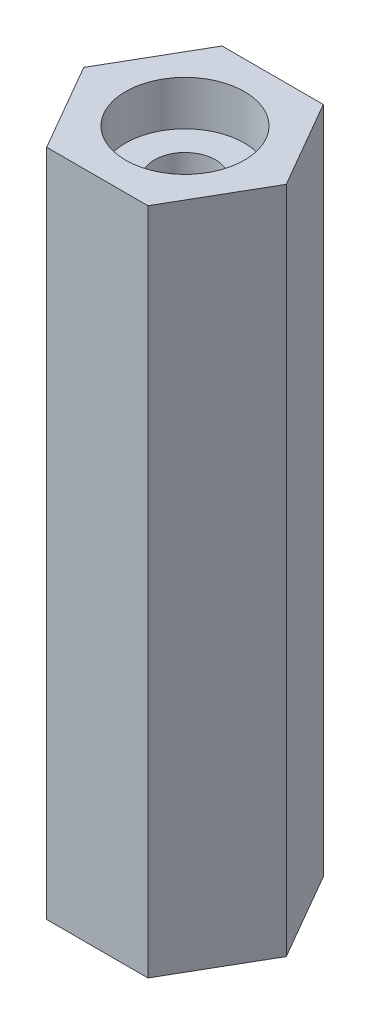
ISO-10303-21;
HEADER;
FILE_DESCRIPTION(('STEP AP214'),'2;1');
FILE_NAME('part.step','',(''),(''),'','','');
FILE_SCHEMA(('AUTOMOTIVE_DESIGN { 1 0 10303 214 1 1 1 1 }'));
ENDSEC;
DATA;
#1=APPLICATION_CONTEXT('core data for automotive mechanical design processes');
#2=APPLICATION_PROTOCOL_DEFINITION('international standard','automotive_design',2000,#1);
#3=PRODUCT_CONTEXT('',#1,'mechanical');
#4=PRODUCT('Part','Part','',(#3));
#5=PRODUCT_RELATED_PRODUCT_CATEGORY('part','',(#4));
#6=PRODUCT_DEFINITION_FORMATION('','',#4);
#7=PRODUCT_DEFINITION_CONTEXT('part definition',#1,'design');
#8=PRODUCT_DEFINITION('design','',#6,#7);
#9=PRODUCT_DEFINITION_SHAPE('','',#8);
#10=(LENGTH_UNIT() NAMED_UNIT(*) SI_UNIT(.MILLI.,.METRE.));
#11=(NAMED_UNIT(*) PLANE_ANGLE_UNIT() SI_UNIT($,.RADIAN.));
#12=(NAMED_UNIT(*) SI_UNIT($,.STERADIAN.) SOLID_ANGLE_UNIT());
#13=UNCERTAINTY_MEASURE_WITH_UNIT(LENGTH_MEASURE(1.E-05),#10,'distance_accuracy_value','');
#14=(GEOMETRIC_REPRESENTATION_CONTEXT(3) GLOBAL_UNCERTAINTY_ASSIGNED_CONTEXT((#13)) GLOBAL_UNIT_ASSIGNED_CONTEXT((#10,
#11,#12)) REPRESENTATION_CONTEXT('',''));
#15=CARTESIAN_POINT('',(0.,0.,0.));
#16=DIRECTION('',(0.,0.,1.));
#17=DIRECTION('',(1.,0.,0.));
#18=AXIS2_PLACEMENT_3D('',#15,#16,#17);
#19=CARTESIAN_POINT('',(3.4063665882188,45.,5.9));
#20=DIRECTION('',(-0.866025403784439,0.,-0.5));
#21=DIRECTION('',(-0.5,0.,0.866025403784439));
#22=AXIS2_PLACEMENT_3D('',#19,#20,#21);
#23=PLANE('',#22);
#24=DIRECTION('',(0.5,0.,-0.866025403784439));
#25=VECTOR('',#24,1.);
#26=CARTESIAN_POINT('',(3.4063665882188,0.,5.9));
#27=LINE('',#26,#25);
#28=CARTESIAN_POINT('',(3.4063665882188,0.,5.9));
#29=VERTEX_POINT('',#28);
#30=CARTESIAN_POINT('',(6.81273317643759,0.,0.));
#31=VERTEX_POINT('',#30);
#32=EDGE_CURVE('E117',#29,#31,#27,.T.);
#33=ORIENTED_EDGE('',*,*,#32,.T.);
#34=DIRECTION('',(0.,-1.,0.));
#35=VECTOR('',#34,1.);
#36=CARTESIAN_POINT('',(6.81273317643759,45.,0.));
#37=LINE('',#36,#35);
#38=CARTESIAN_POINT('',(6.81273317643759,45.,0.));
#39=VERTEX_POINT('',#38);
#40=EDGE_CURVE('E40',#39,#31,#37,.T.);
#41=ORIENTED_EDGE('',*,*,#40,.F.);
#42=DIRECTION('',(0.5,0.,-0.866025403784439));
#43=VECTOR('',#42,1.);
#44=CARTESIAN_POINT('',(3.4063665882188,45.,5.9));
#45=LINE('',#44,#43);
#46=CARTESIAN_POINT('',(3.4063665882188,45.,5.9));
#47=VERTEX_POINT('',#46);
#48=EDGE_CURVE('E120',#47,#39,#45,.T.);
#49=ORIENTED_EDGE('',*,*,#48,.F.);
#50=DIRECTION('',(0.,-1.,0.));
#51=VECTOR('',#50,1.);
#52=CARTESIAN_POINT('',(3.4063665882188,45.,5.9));
#53=LINE('',#52,#51);
#54=EDGE_CURVE('E134',#47,#29,#53,.T.);
#55=ORIENTED_EDGE('',*,*,#54,.T.);
#56=EDGE_LOOP('',(#33,#41,#49,#55));
#57=FACE_BOUND('',#56,.T.);
#58=ADVANCED_FACE('F33',(#57),#23,.F.);
#59=CARTESIAN_POINT('',(6.81273317643759,45.,0.));
#60=DIRECTION('',(-0.866025403784438,0.,0.5));
#61=DIRECTION('',(0.5,0.,0.866025403784439));
#62=AXIS2_PLACEMENT_3D('',#59,#60,#61);
#63=PLANE('',#62);
#64=DIRECTION('',(-0.5,0.,-0.866025403784439));
#65=VECTOR('',#64,1.);
#66=CARTESIAN_POINT('',(6.81273317643759,0.,0.));
#67=LINE('',#66,#65);
#68=CARTESIAN_POINT('',(3.40636658821879,0.,-5.9));
#69=VERTEX_POINT('',#68);
#70=EDGE_CURVE('E137',#31,#69,#67,.T.);
#71=ORIENTED_EDGE('',*,*,#70,.T.);
#72=DIRECTION('',(0.,-1.,0.));
#73=VECTOR('',#72,1.);
#74=CARTESIAN_POINT('',(3.40636658821879,45.,-5.9));
#75=LINE('',#74,#73);
#76=CARTESIAN_POINT('',(3.40636658821879,45.,-5.9));
#77=VERTEX_POINT('',#76);
#78=EDGE_CURVE('E157',#77,#69,#75,.T.);
#79=ORIENTED_EDGE('',*,*,#78,.F.);
#80=DIRECTION('',(-0.5,0.,-0.866025403784439));
#81=VECTOR('',#80,1.);
#82=CARTESIAN_POINT('',(6.81273317643759,45.,0.));
#83=LINE('',#82,#81);
#84=EDGE_CURVE('E123',#39,#77,#83,.T.);
#85=ORIENTED_EDGE('',*,*,#84,.F.);
#86=ORIENTED_EDGE('',*,*,#40,.T.);
#87=EDGE_LOOP('',(#71,#79,#85,#86));
#88=FACE_BOUND('',#87,.T.);
#89=ADVANCED_FACE('F162',(#88),#63,.F.);
#90=CARTESIAN_POINT('',(3.40636658821879,45.,-5.9));
#91=DIRECTION('',(0.,0.,1.));
#92=DIRECTION('',(1.,0.,0.));
#93=AXIS2_PLACEMENT_3D('',#90,#91,#92);
#94=PLANE('',#93);
#95=DIRECTION('',(-1.,0.,0.));
#96=VECTOR('',#95,1.);
#97=CARTESIAN_POINT('',(3.40636658821879,0.,-5.9));
#98=LINE('',#97,#96);
#99=CARTESIAN_POINT('',(-3.40636658821879,0.,-5.9));
#100=VERTEX_POINT('',#99);
#101=EDGE_CURVE('E139',#69,#100,#98,.T.);
#102=ORIENTED_EDGE('',*,*,#101,.T.);
#103=DIRECTION('',(0.,-1.,0.));
#104=VECTOR('',#103,1.);
#105=CARTESIAN_POINT('',(-3.40636658821879,45.,-5.9));
#106=LINE('',#105,#104);
#107=CARTESIAN_POINT('',(-3.40636658821879,45.,-5.9));
#108=VERTEX_POINT('',#107);
#109=EDGE_CURVE('E154',#108,#100,#106,.T.);
#110=ORIENTED_EDGE('',*,*,#109,.F.);
#111=DIRECTION('',(-1.,0.,0.));
#112=VECTOR('',#111,1.);
#113=CARTESIAN_POINT('',(3.40636658821879,45.,-5.9));
#114=LINE('',#113,#112);
#115=EDGE_CURVE('E126',#77,#108,#114,.T.);
#116=ORIENTED_EDGE('',*,*,#115,.F.);
#117=ORIENTED_EDGE('',*,*,#78,.T.);
#118=EDGE_LOOP('',(#102,#110,#116,#117));
#119=FACE_BOUND('',#118,.T.);
#120=ADVANCED_FACE('F176',(#119),#94,.F.);
#121=CARTESIAN_POINT('',(-3.40636658821879,45.,-5.9));
#122=DIRECTION('',(0.866025403784439,0.,0.5));
#123=DIRECTION('',(0.5,0.,-0.866025403784439));
#124=AXIS2_PLACEMENT_3D('',#121,#122,#123);
#125=PLANE('',#124);
#126=DIRECTION('',(-0.5,0.,0.866025403784439));
#127=VECTOR('',#126,1.);
#128=CARTESIAN_POINT('',(-3.40636658821879,0.,-5.9));
#129=LINE('',#128,#127);
#130=CARTESIAN_POINT('',(-6.81273317643758,0.,0.));
#131=VERTEX_POINT('',#130);
#132=EDGE_CURVE('E141',#100,#131,#129,.T.);
#133=ORIENTED_EDGE('',*,*,#132,.T.);
#134=DIRECTION('',(0.,-1.,0.));
#135=VECTOR('',#134,1.);
#136=CARTESIAN_POINT('',(-6.81273317643758,45.,0.));
#137=LINE('',#136,#135);
#138=CARTESIAN_POINT('',(-6.81273317643758,45.,0.));
#139=VERTEX_POINT('',#138);
#140=EDGE_CURVE('E151',#139,#131,#137,.T.);
#141=ORIENTED_EDGE('',*,*,#140,.F.);
#142=DIRECTION('',(-0.5,0.,0.866025403784439));
#143=VECTOR('',#142,1.);
#144=CARTESIAN_POINT('',(-3.40636658821879,45.,-5.9));
#145=LINE('',#144,#143);
#146=EDGE_CURVE('E128',#108,#139,#145,.T.);
#147=ORIENTED_EDGE('',*,*,#146,.F.);
#148=ORIENTED_EDGE('',*,*,#109,.T.);
#149=EDGE_LOOP('',(#133,#141,#147,#148));
#150=FACE_BOUND('',#149,.T.);
#151=ADVANCED_FACE('F180',(#150),#125,.F.);
#152=CARTESIAN_POINT('',(-6.81273317643758,45.,0.));
#153=DIRECTION('',(0.866025403784439,0.,-0.5));
#154=DIRECTION('',(-0.5,0.,-0.866025403784439));
#155=AXIS2_PLACEMENT_3D('',#152,#153,#154);
#156=PLANE('',#155);
#157=DIRECTION('',(0.5,0.,0.866025403784439));
#158=VECTOR('',#157,1.);
#159=CARTESIAN_POINT('',(-6.81273317643758,0.,0.));
#160=LINE('',#159,#158);
#161=CARTESIAN_POINT('',(-3.40636658821879,0.,5.9));
#162=VERTEX_POINT('',#161);
#163=EDGE_CURVE('E143',#131,#162,#160,.T.);
#164=ORIENTED_EDGE('',*,*,#163,.T.);
#165=DIRECTION('',(0.,-1.,0.));
#166=VECTOR('',#165,1.);
#167=CARTESIAN_POINT('',(-3.40636658821879,45.,5.9));
#168=LINE('',#167,#166);
#169=CARTESIAN_POINT('',(-3.40636658821879,45.,5.9));
#170=VERTEX_POINT('',#169);
#171=EDGE_CURVE('E148',#170,#162,#168,.T.);
#172=ORIENTED_EDGE('',*,*,#171,.F.);
#173=DIRECTION('',(0.5,0.,0.866025403784439));
#174=VECTOR('',#173,1.);
#175=CARTESIAN_POINT('',(-6.81273317643758,45.,0.));
#176=LINE('',#175,#174);
#177=EDGE_CURVE('E130',#139,#170,#176,.T.);
#178=ORIENTED_EDGE('',*,*,#177,.F.);
#179=ORIENTED_EDGE('',*,*,#140,.T.);
#180=EDGE_LOOP('',(#164,#172,#178,#179));
#181=FACE_BOUND('',#180,.T.);
#182=ADVANCED_FACE('F190',(#181),#156,.F.);
#183=CARTESIAN_POINT('',(-3.40636658821879,45.,5.9));
#184=DIRECTION('',(0.,0.,-1.));
#185=DIRECTION('',(-1.,0.,0.));
#186=AXIS2_PLACEMENT_3D('',#183,#184,#185);
#187=PLANE('',#186);
#188=DIRECTION('',(1.,0.,0.));
#189=VECTOR('',#188,1.);
#190=CARTESIAN_POINT('',(-3.40636658821879,0.,5.9));
#191=LINE('',#190,#189);
#192=EDGE_CURVE('E124',#162,#29,#191,.T.);
#193=ORIENTED_EDGE('',*,*,#192,.T.);
#194=ORIENTED_EDGE('',*,*,#54,.F.);
#195=DIRECTION('',(1.,0.,0.));
#196=VECTOR('',#195,1.);
#197=CARTESIAN_POINT('',(-3.40636658821879,45.,5.9));
#198=LINE('',#197,#196);
#199=EDGE_CURVE('E132',#170,#47,#198,.T.);
#200=ORIENTED_EDGE('',*,*,#199,.F.);
#201=ORIENTED_EDGE('',*,*,#171,.T.);
#202=EDGE_LOOP('',(#193,#194,#200,#201));
#203=FACE_BOUND('',#202,.T.);
#204=ADVANCED_FACE('F188',(#203),#187,.F.);
#205=CARTESIAN_POINT('',(0.,45.,0.));
#206=DIRECTION('',(0.,1.,0.));
#207=DIRECTION('',(0.,0.,1.));
#208=AXIS2_PLACEMENT_3D('',#205,#206,#207);
#209=PLANE('',#208);
#210=CARTESIAN_POINT('',(0.,45.,0.));
#211=DIRECTION('',(0.,1.,0.));
#212=DIRECTION('',(0.,0.,1.));
#213=AXIS2_PLACEMENT_3D('',#210,#211,#212);
#214=CIRCLE('',#213,4.);
#215=CARTESIAN_POINT('',(0.,45.,4.));
#216=VERTEX_POINT('',#215);
#217=EDGE_CURVE('E97',#216,#216,#214,.T.);
#218=ORIENTED_EDGE('',*,*,#217,.F.);
#219=EDGE_LOOP('',(#218));
#220=FACE_BOUND('',#219,.T.);
#221=ORIENTED_EDGE('',*,*,#48,.T.);
#222=ORIENTED_EDGE('',*,*,#84,.T.);
#223=ORIENTED_EDGE('',*,*,#115,.T.);
#224=ORIENTED_EDGE('',*,*,#146,.T.);
#225=ORIENTED_EDGE('',*,*,#177,.T.);
#226=ORIENTED_EDGE('',*,*,#199,.T.);
#227=EDGE_LOOP('',(#221,#222,#223,#224,#225,#226));
#228=FACE_BOUND('',#227,.T.);
#229=ADVANCED_FACE('F184',(#220,#228),#209,.T.);
#230=CARTESIAN_POINT('',(0.,0.,0.));
#231=DIRECTION('',(0.,1.,0.));
#232=DIRECTION('',(0.,0.,1.));
#233=AXIS2_PLACEMENT_3D('',#230,#231,#232);
#234=PLANE('',#233);
#235=ORIENTED_EDGE('',*,*,#32,.F.);
#236=ORIENTED_EDGE('',*,*,#192,.F.);
#237=ORIENTED_EDGE('',*,*,#163,.F.);
#238=ORIENTED_EDGE('',*,*,#132,.F.);
#239=ORIENTED_EDGE('',*,*,#101,.F.);
#240=ORIENTED_EDGE('',*,*,#70,.F.);
#241=EDGE_LOOP('',(#235,#236,#237,#238,#239,#240));
#242=FACE_BOUND('',#241,.T.);
#243=ADVANCED_FACE('F170',(#242),#234,.F.);
#244=CARTESIAN_POINT('',(0.,42.,0.));
#245=DIRECTION('',(0.,1.,0.));
#246=DIRECTION('',(0.,0.,1.));
#247=AXIS2_PLACEMENT_3D('',#244,#245,#246);
#248=CYLINDRICAL_SURFACE('',#247,4.);
#249=CARTESIAN_POINT('',(0.,42.,0.));
#250=DIRECTION('',(0.,1.,0.));
#251=DIRECTION('',(0.,0.,1.));
#252=AXIS2_PLACEMENT_3D('',#249,#250,#251);
#253=CIRCLE('',#252,4.);
#254=CARTESIAN_POINT('',(0.,42.,4.));
#255=VERTEX_POINT('',#254);
#256=EDGE_CURVE('E114',#255,#255,#253,.T.);
#257=ORIENTED_EDGE('',*,*,#256,.F.);
#258=EDGE_LOOP('',(#257));
#259=FACE_BOUND('',#258,.T.);
#260=ORIENTED_EDGE('',*,*,#217,.T.);
#261=EDGE_LOOP('',(#260));
#262=FACE_BOUND('',#261,.T.);
#263=ADVANCED_FACE('F234',(#259,#262),#248,.F.);
#264=CARTESIAN_POINT('',(0.,42.,0.));
#265=DIRECTION('',(0.,1.,0.));
#266=DIRECTION('',(0.,0.,1.));
#267=AXIS2_PLACEMENT_3D('',#264,#265,#266);
#268=PLANE('',#267);
#269=CARTESIAN_POINT('',(0.,42.,0.));
#270=DIRECTION('',(0.,1.,0.));
#271=DIRECTION('',(0.,0.,1.));
#272=AXIS2_PLACEMENT_3D('',#269,#270,#271);
#273=CIRCLE('',#272,2.05);
#274=CARTESIAN_POINT('',(0.,42.,2.05));
#275=VERTEX_POINT('',#274);
#276=EDGE_CURVE('E98',#275,#275,#273,.T.);
#277=ORIENTED_EDGE('',*,*,#276,.F.);
#278=EDGE_LOOP('',(#277));
#279=FACE_BOUND('',#278,.T.);
#280=ORIENTED_EDGE('',*,*,#256,.T.);
#281=EDGE_LOOP('',(#280));
#282=FACE_BOUND('',#281,.T.);
#283=ADVANCED_FACE('F250',(#279,#282),#268,.T.);
#284=CARTESIAN_POINT('',(0.,31.,0.));
#285=DIRECTION('',(0.,1.,0.));
#286=DIRECTION('',(0.,0.,1.));
#287=AXIS2_PLACEMENT_3D('',#284,#285,#286);
#288=CYLINDRICAL_SURFACE('',#287,2.05);
#289=CARTESIAN_POINT('',(0.,39.5,0.));
#290=DIRECTION('',(0.,1.,0.));
#291=DIRECTION('',(0.,0.,1.));
#292=AXIS2_PLACEMENT_3D('',#289,#290,#291);
#293=CIRCLE('',#292,2.05);
#294=CARTESIAN_POINT('',(1.44913767461894,39.5,-1.45));
#295=VERTEX_POINT('',#294);
#296=CARTESIAN_POINT('',(-1.44913767461894,39.5,-1.45));
#297=VERTEX_POINT('',#296);
#298=EDGE_CURVE('E47',#295,#297,#293,.T.);
#299=ORIENTED_EDGE('',*,*,#298,.F.);
#300=DIRECTION('',(0.,1.,0.));
#301=VECTOR('',#300,1.);
#302=CARTESIAN_POINT('',(1.44913767461894,28.5,-1.45));
#303=LINE('',#302,#301);
#304=CARTESIAN_POINT('',(1.44913767461894,31.,-1.45));
#305=VERTEX_POINT('',#304);
#306=EDGE_CURVE('E100',#305,#295,#303,.T.);
#307=ORIENTED_EDGE('',*,*,#306,.F.);
#308=CARTESIAN_POINT('',(0.,31.,0.));
#309=DIRECTION('',(0.,1.,0.));
#310=DIRECTION('',(0.,0.,1.));
#311=AXIS2_PLACEMENT_3D('',#308,#309,#310);
#312=CIRCLE('',#311,2.05);
#313=CARTESIAN_POINT('',(-1.44913767461894,31.,-1.45));
#314=VERTEX_POINT('',#313);
#315=EDGE_CURVE('E95',#314,#305,#312,.T.);
#316=ORIENTED_EDGE('',*,*,#315,.F.);
#317=DIRECTION('',(0.,1.,0.));
#318=VECTOR('',#317,1.);
#319=CARTESIAN_POINT('',(-1.44913767461894,28.5,-1.45));
#320=LINE('',#319,#318);
#321=EDGE_CURVE('E52',#314,#297,#320,.T.);
#322=ORIENTED_EDGE('',*,*,#321,.T.);
#323=EDGE_LOOP('',(#299,#307,#316,#322));
#324=FACE_BOUND('',#323,.T.);
#325=ORIENTED_EDGE('',*,*,#276,.T.);
#326=EDGE_LOOP('',(#325));
#327=FACE_BOUND('',#326,.T.);
#328=ADVANCED_FACE('F101',(#324,#327),#288,.F.);
#329=CARTESIAN_POINT('',(0.,31.,0.));
#330=DIRECTION('',(0.,1.,0.));
#331=DIRECTION('',(0.,0.,1.));
#332=AXIS2_PLACEMENT_3D('',#329,#330,#331);
#333=PLANE('',#332);
#334=DIRECTION('',(1.,0.,0.));
#335=VECTOR('',#334,1.);
#336=CARTESIAN_POINT('',(0.,31.,-1.45));
#337=LINE('',#336,#335);
#338=EDGE_CURVE('E11',#314,#305,#337,.T.);
#339=ORIENTED_EDGE('',*,*,#338,.F.);
#340=ORIENTED_EDGE('',*,*,#315,.T.);
#341=EDGE_LOOP('',(#339,#340));
#342=FACE_BOUND('',#341,.T.);
#343=ADVANCED_FACE('F96',(#342),#333,.T.);
#344=CARTESIAN_POINT('',(-1.44913767461894,28.5,-1.45));
#345=DIRECTION('',(0.,0.,1.));
#346=DIRECTION('',(1.,0.,0.));
#347=AXIS2_PLACEMENT_3D('',#344,#345,#346);
#348=PLANE('',#347);
#349=ORIENTED_EDGE('',*,*,#321,.F.);
#350=ORIENTED_EDGE('',*,*,#338,.T.);
#351=ORIENTED_EDGE('',*,*,#306,.T.);
#352=DIRECTION('',(1.,0.,0.));
#353=VECTOR('',#352,1.);
#354=CARTESIAN_POINT('',(-1.44913767461894,39.5,-1.45));
#355=LINE('',#354,#353);
#356=EDGE_CURVE('E108',#297,#295,#355,.T.);
#357=ORIENTED_EDGE('',*,*,#356,.F.);
#358=EDGE_LOOP('',(#349,#350,#351,#357));
#359=FACE_BOUND('',#358,.T.);
#360=ADVANCED_FACE('F107',(#359),#348,.T.);
#361=CARTESIAN_POINT('',(0.,39.5,0.));
#362=DIRECTION('',(0.,1.,0.));
#363=DIRECTION('',(0.,0.,1.));
#364=AXIS2_PLACEMENT_3D('',#361,#362,#363);
#365=PLANE('',#364);
#366=ORIENTED_EDGE('',*,*,#298,.T.);
#367=ORIENTED_EDGE('',*,*,#356,.T.);
#368=EDGE_LOOP('',(#366,#367));
#369=FACE_BOUND('',#368,.T.);
#370=ADVANCED_FACE('F285',(#369),#365,.T.);
#371=CLOSED_SHELL('',(#58,#89,#120,#151,#182,#204,#229,#243,#263,#283,#328,#343,#360,#370));
#372=MANIFOLD_SOLID_BREP('B2',#371);
#373=ADVANCED_BREP_SHAPE_REPRESENTATION('',(#18,#372),#14);
#374=SHAPE_DEFINITION_REPRESENTATION(#9,#373);
ENDSEC;
END-ISO-10303-21;
